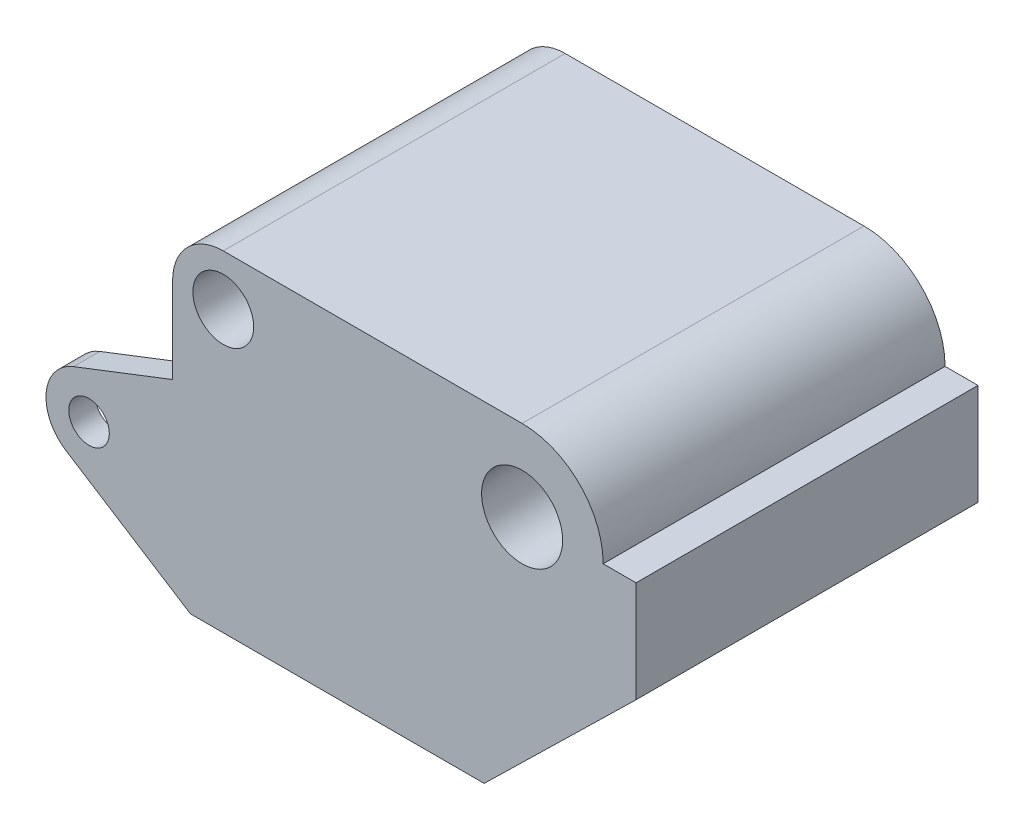
ISO-10303-21;
HEADER;
FILE_DESCRIPTION(('STEP AP214'),'2;1');
FILE_NAME('part.step','',(''),(''),'','','');
FILE_SCHEMA(('AUTOMOTIVE_DESIGN { 1 0 10303 214 1 1 1 1 }'));
ENDSEC;
DATA;
#1=APPLICATION_CONTEXT('core data for automotive mechanical design processes');
#2=APPLICATION_PROTOCOL_DEFINITION('international standard','automotive_design',2000,#1);
#3=PRODUCT_CONTEXT('',#1,'mechanical');
#4=PRODUCT('Part','Part','',(#3));
#5=PRODUCT_RELATED_PRODUCT_CATEGORY('part','',(#4));
#6=PRODUCT_DEFINITION_FORMATION('','',#4);
#7=PRODUCT_DEFINITION_CONTEXT('part definition',#1,'design');
#8=PRODUCT_DEFINITION('design','',#6,#7);
#9=PRODUCT_DEFINITION_SHAPE('','',#8);
#10=(LENGTH_UNIT() NAMED_UNIT(*) SI_UNIT(.MILLI.,.METRE.));
#11=(NAMED_UNIT(*) PLANE_ANGLE_UNIT() SI_UNIT($,.RADIAN.));
#12=(NAMED_UNIT(*) SI_UNIT($,.STERADIAN.) SOLID_ANGLE_UNIT());
#13=UNCERTAINTY_MEASURE_WITH_UNIT(LENGTH_MEASURE(1.E-05),#10,'distance_accuracy_value','');
#14=(GEOMETRIC_REPRESENTATION_CONTEXT(3) GLOBAL_UNCERTAINTY_ASSIGNED_CONTEXT((#13)) GLOBAL_UNIT_ASSIGNED_CONTEXT((#10,
#11,#12)) REPRESENTATION_CONTEXT('',''));
#15=CARTESIAN_POINT('',(0.,0.,0.));
#16=DIRECTION('',(0.,0.,1.));
#17=DIRECTION('',(1.,0.,0.));
#18=AXIS2_PLACEMENT_3D('',#15,#16,#17);
#19=CARTESIAN_POINT('',(34.9717534777319,-90.3641278351745,-8.75));
#20=DIRECTION('',(-0.360923115130806,0.932595574171503,0.));
#21=DIRECTION('',(-0.932595574171503,-0.360923115130806,0.));
#22=AXIS2_PLACEMENT_3D('',#19,#20,#21);
#23=PLANE('',#22);
#24=DIRECTION('',(0.,0.,1.));
#25=VECTOR('',#24,1.);
#26=CARTESIAN_POINT('',(-38.375,-118.75,-8.75));
#27=LINE('',#26,#25);
#28=CARTESIAN_POINT('',(-38.375,-118.75,-8.625));
#29=VERTEX_POINT('',#28);
#30=CARTESIAN_POINT('',(-38.375,-118.75,8.25));
#31=VERTEX_POINT('',#30);
#32=EDGE_CURVE('E101',#29,#31,#27,.T.);
#33=ORIENTED_EDGE('',*,*,#32,.F.);
#34=DIRECTION('',(-0.932595574171503,-0.360923115130806,0.));
#35=VECTOR('',#34,1.);
#36=CARTESIAN_POINT('',(34.9717534777319,-90.3641278351745,-8.62500000000001));
#37=LINE('',#36,#35);
#38=CARTESIAN_POINT('',(-43.266961619653,-120.643234404886,-8.625));
#39=VERTEX_POINT('',#38);
#40=EDGE_CURVE('E303',#29,#39,#37,.T.);
#41=ORIENTED_EDGE('',*,*,#40,.T.);
#42=DIRECTION('',(0.,0.,1.));
#43=VECTOR('',#42,1.);
#44=CARTESIAN_POINT('',(-43.266961619653,-120.643234404886,-8.75));
#45=LINE('',#44,#43);
#46=CARTESIAN_POINT('',(-43.266961619653,-120.643234404886,-7.325));
#47=VERTEX_POINT('',#46);
#48=EDGE_CURVE('E231',#39,#47,#45,.T.);
#49=ORIENTED_EDGE('',*,*,#48,.T.);
#50=DIRECTION('',(0.932595574171503,0.360923115130806,0.));
#51=VECTOR('',#50,1.);
#52=CARTESIAN_POINT('',(34.9717534777319,-90.3641278351745,-7.325));
#53=LINE('',#52,#51);
#54=CARTESIAN_POINT('',(-39.45,-119.166034945384,-7.325));
#55=VERTEX_POINT('',#54);
#56=EDGE_CURVE('E323',#47,#55,#53,.T.);
#57=ORIENTED_EDGE('',*,*,#56,.T.);
#58=DIRECTION('',(0.,0.,1.));
#59=VECTOR('',#58,1.);
#60=CARTESIAN_POINT('',(-39.45,-119.166034945384,-8.75));
#61=LINE('',#60,#59);
#62=CARTESIAN_POINT('',(-39.45,-119.166034945384,6.95));
#63=VERTEX_POINT('',#62);
#64=EDGE_CURVE('E326',#55,#63,#61,.T.);
#65=ORIENTED_EDGE('',*,*,#64,.T.);
#66=DIRECTION('',(0.932595574171503,0.360923115130806,0.));
#67=VECTOR('',#66,1.);
#68=CARTESIAN_POINT('',(34.9717534777319,-90.3641278351745,6.95));
#69=LINE('',#68,#67);
#70=CARTESIAN_POINT('',(-43.266961619653,-120.643234404886,6.95));
#71=VERTEX_POINT('',#70);
#72=EDGE_CURVE('E242',#71,#63,#69,.T.);
#73=ORIENTED_EDGE('',*,*,#72,.F.);
#74=CARTESIAN_POINT('',(-43.266961619653,-120.643234404886,8.25));
#75=VERTEX_POINT('',#74);
#76=EDGE_CURVE('E233',#71,#75,#45,.T.);
#77=ORIENTED_EDGE('',*,*,#76,.T.);
#78=DIRECTION('',(0.932595574171503,0.360923115130806,0.));
#79=VECTOR('',#78,1.);
#80=CARTESIAN_POINT('',(34.9717534777319,-90.3641278351745,8.24999999999999));
#81=LINE('',#80,#79);
#82=EDGE_CURVE('E117',#75,#31,#81,.T.);
#83=ORIENTED_EDGE('',*,*,#82,.T.);
#84=EDGE_LOOP('',(#33,#41,#49,#57,#65,#73,#77,#83));
#85=FACE_BOUND('',#84,.T.);
#86=ADVANCED_FACE('F93',(#85),#23,.T.);
#87=CARTESIAN_POINT('',(-68.9263475557154,-108.329490527067,-8.75));
#88=DIRECTION('',(0.536816725384805,0.84369888191649,0.));
#89=DIRECTION('',(-0.84369888191649,0.536816725384805,0.));
#90=AXIS2_PLACEMENT_3D('',#87,#88,#89);
#91=PLANE('',#90);
#92=DIRECTION('',(-0.84369888191649,0.536816725384805,0.));
#93=VECTOR('',#92,1.);
#94=CARTESIAN_POINT('',(-68.9263475557154,-108.329490527067,-8.62499999999999));
#95=LINE('',#94,#93);
#96=CARTESIAN_POINT('',(-37.5,-128.325,-8.625));
#97=VERTEX_POINT('',#96);
#98=CARTESIAN_POINT('',(-43.6407355414427,-124.417860124073,-8.625));
#99=VERTEX_POINT('',#98);
#100=EDGE_CURVE('E201',#97,#99,#95,.T.);
#101=ORIENTED_EDGE('',*,*,#100,.F.);
#102=DIRECTION('',(0.,0.,1.));
#103=VECTOR('',#102,1.);
#104=CARTESIAN_POINT('',(-37.5,-128.325,-8.75));
#105=LINE('',#104,#103);
#106=CARTESIAN_POINT('',(-37.5,-128.325,8.25));
#107=VERTEX_POINT('',#106);
#108=EDGE_CURVE('E215',#97,#107,#105,.T.);
#109=ORIENTED_EDGE('',*,*,#108,.T.);
#110=DIRECTION('',(0.84369888191649,-0.536816725384805,0.));
#111=VECTOR('',#110,1.);
#112=CARTESIAN_POINT('',(-68.9263475557154,-108.329490527067,8.25));
#113=LINE('',#112,#111);
#114=CARTESIAN_POINT('',(-43.6407355414427,-124.417860124073,8.25));
#115=VERTEX_POINT('',#114);
#116=EDGE_CURVE('E247',#115,#107,#113,.T.);
#117=ORIENTED_EDGE('',*,*,#116,.F.);
#118=DIRECTION('',(0.,0.,1.));
#119=VECTOR('',#118,1.);
#120=CARTESIAN_POINT('',(-43.6407355414427,-124.417860124073,-8.75));
#121=LINE('',#120,#119);
#122=CARTESIAN_POINT('',(-43.6407355414427,-124.417860124073,6.95));
#123=VERTEX_POINT('',#122);
#124=EDGE_CURVE('E227',#123,#115,#121,.T.);
#125=ORIENTED_EDGE('',*,*,#124,.F.);
#126=DIRECTION('',(0.84369888191649,-0.536816725384805,0.));
#127=VECTOR('',#126,1.);
#128=CARTESIAN_POINT('',(-68.9263475557154,-108.329490527067,6.95));
#129=LINE('',#128,#127);
#130=CARTESIAN_POINT('',(-39.45,-127.084281733167,6.95));
#131=VERTEX_POINT('',#130);
#132=EDGE_CURVE('E315',#123,#131,#129,.T.);
#133=ORIENTED_EDGE('',*,*,#132,.T.);
#134=DIRECTION('',(0.,0.,1.));
#135=VECTOR('',#134,1.);
#136=CARTESIAN_POINT('',(-39.45,-127.084281733167,-8.75));
#137=LINE('',#136,#135);
#138=CARTESIAN_POINT('',(-39.45,-127.084281733167,-7.325));
#139=VERTEX_POINT('',#138);
#140=EDGE_CURVE('E13',#139,#131,#137,.T.);
#141=ORIENTED_EDGE('',*,*,#140,.F.);
#142=DIRECTION('',(0.84369888191649,-0.536816725384805,0.));
#143=VECTOR('',#142,1.);
#144=CARTESIAN_POINT('',(-68.9263475557154,-108.329490527067,-7.325));
#145=LINE('',#144,#143);
#146=CARTESIAN_POINT('',(-43.6407355414427,-124.417860124073,-7.325));
#147=VERTEX_POINT('',#146);
#148=EDGE_CURVE('E321',#147,#139,#145,.T.);
#149=ORIENTED_EDGE('',*,*,#148,.F.);
#150=EDGE_CURVE('E217',#99,#147,#121,.T.);
#151=ORIENTED_EDGE('',*,*,#150,.F.);
#152=EDGE_LOOP('',(#101,#109,#117,#125,#133,#141,#149,#151));
#153=FACE_BOUND('',#152,.T.);
#154=ADVANCED_FACE('F213',(#153),#91,.F.);
#155=CARTESIAN_POINT('',(-42.5,-122.625,-8.75));
#156=DIRECTION('',(0.,0.,1.));
#157=DIRECTION('',(1.,0.,0.));
#158=AXIS2_PLACEMENT_3D('',#155,#156,#157);
#159=CYLINDRICAL_SURFACE('',#158,2.125);
#160=ORIENTED_EDGE('',*,*,#48,.F.);
#161=CARTESIAN_POINT('',(-42.5,-122.625,-8.625));
#162=DIRECTION('',(0.,0.,-1.));
#163=DIRECTION('',(-1.,0.,0.));
#164=AXIS2_PLACEMENT_3D('',#161,#162,#163);
#165=CIRCLE('',#164,2.125);
#166=EDGE_CURVE('E219',#39,#99,#165,.F.);
#167=ORIENTED_EDGE('',*,*,#166,.T.);
#168=ORIENTED_EDGE('',*,*,#150,.T.);
#169=CARTESIAN_POINT('',(-42.5,-122.625,-7.325));
#170=DIRECTION('',(0.,0.,1.));
#171=DIRECTION('',(1.,0.,0.));
#172=AXIS2_PLACEMENT_3D('',#169,#170,#171);
#173=CIRCLE('',#172,2.125);
#174=EDGE_CURVE('E241',#147,#47,#173,.F.);
#175=ORIENTED_EDGE('',*,*,#174,.T.);
#176=EDGE_LOOP('',(#160,#167,#168,#175));
#177=FACE_BOUND('',#176,.T.);
#178=ADVANCED_FACE('F392',(#177),#159,.T.);
#179=CARTESIAN_POINT('',(-42.5,-122.625,-8.75));
#180=DIRECTION('',(0.,0.,1.));
#181=DIRECTION('',(1.,0.,0.));
#182=AXIS2_PLACEMENT_3D('',#179,#180,#181);
#183=CYLINDRICAL_SURFACE('',#182,0.999999999999998);
#184=CARTESIAN_POINT('',(-42.5,-122.625,-7.325));
#185=DIRECTION('',(0.,0.,1.));
#186=DIRECTION('',(1.,0.,0.));
#187=AXIS2_PLACEMENT_3D('',#184,#185,#186);
#188=CIRCLE('',#187,0.999999999999998);
#189=CARTESIAN_POINT('',(-41.5,-122.625,-7.325));
#190=VERTEX_POINT('',#189);
#191=EDGE_CURVE('E239',#190,#190,#188,.F.);
#192=CARTESIAN_POINT('',(-42.5,-122.625,-8.625));
#193=DIRECTION('',(0.,0.,-1.));
#194=DIRECTION('',(-1.,0.,0.));
#195=AXIS2_PLACEMENT_3D('',#192,#193,#194);
#196=CIRCLE('',#195,0.999999999999998);
#197=CARTESIAN_POINT('',(-41.5,-122.625,-8.625));
#198=VERTEX_POINT('',#197);
#199=EDGE_CURVE('E218',#198,#198,#196,.F.);
#200=CARTESIAN_POINT('',(-41.5,-122.625,-7.325));
#201=CARTESIAN_POINT('',(-41.5,-122.625,-7.33854166666667));
#202=CARTESIAN_POINT('',(-41.5,-122.625,-7.35208333333333));
#203=CARTESIAN_POINT('',(-41.5,-122.625,-7.37916666666667));
#204=CARTESIAN_POINT('',(-41.5,-122.625,-7.39270833333333));
#205=CARTESIAN_POINT('',(-41.5,-122.625,-7.41979166666667));
#206=CARTESIAN_POINT('',(-41.5,-122.625,-7.43333333333333));
#207=CARTESIAN_POINT('',(-41.5,-122.625,-7.46041666666667));
#208=CARTESIAN_POINT('',(-41.5,-122.625,-7.47395833333333));
#209=CARTESIAN_POINT('',(-41.5,-122.625,-7.50104166666667));
#210=CARTESIAN_POINT('',(-41.5,-122.625,-7.51458333333333));
#211=CARTESIAN_POINT('',(-41.5,-122.625,-7.54166666666667));
#212=CARTESIAN_POINT('',(-41.5,-122.625,-7.55520833333333));
#213=CARTESIAN_POINT('',(-41.5,-122.625,-7.58229166666667));
#214=CARTESIAN_POINT('',(-41.5,-122.625,-7.59583333333333));
#215=CARTESIAN_POINT('',(-41.5,-122.625,-7.62291666666667));
#216=CARTESIAN_POINT('',(-41.5,-122.625,-7.63645833333333));
#217=CARTESIAN_POINT('',(-41.5,-122.625,-7.66354166666667));
#218=CARTESIAN_POINT('',(-41.5,-122.625,-7.67708333333333));
#219=CARTESIAN_POINT('',(-41.5,-122.625,-7.70416666666667));
#220=CARTESIAN_POINT('',(-41.5,-122.625,-7.71770833333333));
#221=CARTESIAN_POINT('',(-41.5,-122.625,-7.74479166666667));
#222=CARTESIAN_POINT('',(-41.5,-122.625,-7.75833333333333));
#223=CARTESIAN_POINT('',(-41.5,-122.625,-7.78541666666667));
#224=CARTESIAN_POINT('',(-41.5,-122.625,-7.79895833333333));
#225=CARTESIAN_POINT('',(-41.5,-122.625,-7.82604166666667));
#226=CARTESIAN_POINT('',(-41.5,-122.625,-7.83958333333333));
#227=CARTESIAN_POINT('',(-41.5,-122.625,-7.86666666666667));
#228=CARTESIAN_POINT('',(-41.5,-122.625,-7.88020833333333));
#229=CARTESIAN_POINT('',(-41.5,-122.625,-7.90729166666667));
#230=CARTESIAN_POINT('',(-41.5,-122.625,-7.92083333333333));
#231=CARTESIAN_POINT('',(-41.5,-122.625,-7.94791666666667));
#232=CARTESIAN_POINT('',(-41.5,-122.625,-7.96145833333333));
#233=CARTESIAN_POINT('',(-41.5,-122.625,-7.98854166666667));
#234=CARTESIAN_POINT('',(-41.5,-122.625,-8.00208333333333));
#235=CARTESIAN_POINT('',(-41.5,-122.625,-8.02916666666667));
#236=CARTESIAN_POINT('',(-41.5,-122.625,-8.04270833333333));
#237=CARTESIAN_POINT('',(-41.5,-122.625,-8.06979166666667));
#238=CARTESIAN_POINT('',(-41.5,-122.625,-8.08333333333333));
#239=CARTESIAN_POINT('',(-41.5,-122.625,-8.11041666666667));
#240=CARTESIAN_POINT('',(-41.5,-122.625,-8.12395833333333));
#241=CARTESIAN_POINT('',(-41.5,-122.625,-8.15104166666667));
#242=CARTESIAN_POINT('',(-41.5,-122.625,-8.16458333333333));
#243=CARTESIAN_POINT('',(-41.5,-122.625,-8.19166666666667));
#244=CARTESIAN_POINT('',(-41.5,-122.625,-8.20520833333333));
#245=CARTESIAN_POINT('',(-41.5,-122.625,-8.23229166666667));
#246=CARTESIAN_POINT('',(-41.5,-122.625,-8.24583333333333));
#247=CARTESIAN_POINT('',(-41.5,-122.625,-8.27291666666667));
#248=CARTESIAN_POINT('',(-41.5,-122.625,-8.28645833333333));
#249=CARTESIAN_POINT('',(-41.5,-122.625,-8.31354166666667));
#250=CARTESIAN_POINT('',(-41.5,-122.625,-8.32708333333333));
#251=CARTESIAN_POINT('',(-41.5,-122.625,-8.35416666666667));
#252=CARTESIAN_POINT('',(-41.5,-122.625,-8.36770833333333));
#253=CARTESIAN_POINT('',(-41.5,-122.625,-8.39479166666667));
#254=CARTESIAN_POINT('',(-41.5,-122.625,-8.40833333333333));
#255=CARTESIAN_POINT('',(-41.5,-122.625,-8.43541666666667));
#256=CARTESIAN_POINT('',(-41.5,-122.625,-8.44895833333333));
#257=CARTESIAN_POINT('',(-41.5,-122.625,-8.47604166666667));
#258=CARTESIAN_POINT('',(-41.5,-122.625,-8.48958333333333));
#259=CARTESIAN_POINT('',(-41.5,-122.625,-8.51666666666667));
#260=CARTESIAN_POINT('',(-41.5,-122.625,-8.53020833333333));
#261=CARTESIAN_POINT('',(-41.5,-122.625,-8.55729166666667));
#262=CARTESIAN_POINT('',(-41.5,-122.625,-8.57083333333333));
#263=CARTESIAN_POINT('',(-41.5,-122.625,-8.59791666666667));
#264=CARTESIAN_POINT('',(-41.5,-122.625,-8.61145833333333));
#265=CARTESIAN_POINT('',(-41.5,-122.625,-8.625));
#266=B_SPLINE_CURVE_WITH_KNOTS('',3,(#200,#201,#202,#203,#204,#205,#206,#207,#208,#209,#210,
#211,#212,#213,#214,#215,#216,#217,#218,#219,#220,#221,#222,#223,#224,#225,#226,#227,#228,#229,
#230,#231,#232,#233,#234,#235,#236,#237,#238,#239,#240,#241,#242,#243,#244,#245,#246,#247,#248,
#249,#250,#251,#252,#253,#254,#255,#256,#257,#258,#259,#260,#261,#262,#263,#264,#265),
.UNSPECIFIED.,.F.,.F.,(4,2,2,2,2,2,2,2,2,2,2,2,2,2,2,2,2,2,2,2,2,2,2,2,2,2,2,2,2,2,2,2,4),(0.,
0.0406250000000007,0.0812500000000006,0.121875,0.1625,0.203125,0.24375,0.284375,
0.325000000000001,0.365625,0.40625,0.446875,0.4875,0.528125000000001,0.56875,0.609375000000001,
0.65,0.690625,0.731250000000001,0.771875,0.812500000000001,0.853125,0.89375,0.934374999999999,
0.975,1.015625,1.05625,1.096875,1.1375,1.178125,1.21875,1.259375,1.3),.UNSPECIFIED.);
#267=EDGE_CURVE('BSEAM394',#190,#198,#266,.T.);
#268=ORIENTED_EDGE('',*,*,#191,.F.);
#269=ORIENTED_EDGE('',*,*,#199,.F.);
#270=ORIENTED_EDGE('',*,*,#267,.T.);
#271=ORIENTED_EDGE('',*,*,#267,.F.);
#272=EDGE_LOOP('',(#268,#270,#269,#271));
#273=FACE_BOUND('',#272,.T.);
#274=ADVANCED_FACE('F394',(#273),#183,.F.);
#275=CARTESIAN_POINT('',(-38.375,0.,-8.75));
#276=DIRECTION('',(-1.,0.,0.));
#277=DIRECTION('',(0.,0.,1.));
#278=AXIS2_PLACEMENT_3D('',#275,#276,#277);
#279=PLANE('',#278);
#280=DIRECTION('',(0.,0.,1.));
#281=VECTOR('',#280,1.);
#282=CARTESIAN_POINT('',(-38.375,-114.5,-8.75));
#283=LINE('',#282,#281);
#284=CARTESIAN_POINT('',(-38.375,-114.5,-8.625));
#285=VERTEX_POINT('',#284);
#286=CARTESIAN_POINT('',(-38.375,-114.5,8.25));
#287=VERTEX_POINT('',#286);
#288=EDGE_CURVE('E331',#285,#287,#283,.T.);
#289=ORIENTED_EDGE('',*,*,#288,.F.);
#290=DIRECTION('',(0.,-1.,0.));
#291=VECTOR('',#290,1.);
#292=CARTESIAN_POINT('',(-38.375,0.,-8.625));
#293=LINE('',#292,#291);
#294=EDGE_CURVE('E300',#285,#29,#293,.T.);
#295=ORIENTED_EDGE('',*,*,#294,.T.);
#296=ORIENTED_EDGE('',*,*,#32,.T.);
#297=DIRECTION('',(0.,1.,0.));
#298=VECTOR('',#297,1.);
#299=CARTESIAN_POINT('',(-38.375,0.,8.25));
#300=LINE('',#299,#298);
#301=EDGE_CURVE('E257',#31,#287,#300,.T.);
#302=ORIENTED_EDGE('',*,*,#301,.T.);
#303=EDGE_LOOP('',(#289,#295,#296,#302));
#304=FACE_BOUND('',#303,.T.);
#305=ADVANCED_FACE('F370',(#304),#279,.T.);
#306=CARTESIAN_POINT('',(-35.875,-114.5,-8.75));
#307=DIRECTION('',(0.,0.,1.));
#308=DIRECTION('',(1.,0.,0.));
#309=AXIS2_PLACEMENT_3D('',#306,#307,#308);
#310=CYLINDRICAL_SURFACE('',#309,2.5);
#311=DIRECTION('',(0.,0.,1.));
#312=VECTOR('',#311,1.);
#313=CARTESIAN_POINT('',(-35.875,-112.,-8.75));
#314=LINE('',#313,#312);
#315=CARTESIAN_POINT('',(-35.875,-112.,-8.625));
#316=VERTEX_POINT('',#315);
#317=CARTESIAN_POINT('',(-35.875,-112.,8.25));
#318=VERTEX_POINT('',#317);
#319=EDGE_CURVE('E334',#316,#318,#314,.T.);
#320=ORIENTED_EDGE('',*,*,#319,.F.);
#321=CARTESIAN_POINT('',(-35.875,-114.5,-8.625));
#322=DIRECTION('',(0.,0.,-1.));
#323=DIRECTION('',(-1.,0.,0.));
#324=AXIS2_PLACEMENT_3D('',#321,#322,#323);
#325=CIRCLE('',#324,2.5);
#326=EDGE_CURVE('E297',#316,#285,#325,.F.);
#327=ORIENTED_EDGE('',*,*,#326,.T.);
#328=ORIENTED_EDGE('',*,*,#288,.T.);
#329=CARTESIAN_POINT('',(-35.875,-114.5,8.25));
#330=DIRECTION('',(0.,0.,1.));
#331=DIRECTION('',(1.,0.,0.));
#332=AXIS2_PLACEMENT_3D('',#329,#330,#331);
#333=CIRCLE('',#332,2.5);
#334=EDGE_CURVE('E260',#287,#318,#333,.F.);
#335=ORIENTED_EDGE('',*,*,#334,.T.);
#336=EDGE_LOOP('',(#320,#327,#328,#335));
#337=FACE_BOUND('',#336,.T.);
#338=ADVANCED_FACE('F367',(#337),#310,.T.);
#339=CARTESIAN_POINT('',(0.,-112.,-8.75));
#340=DIRECTION('',(0.,1.,0.));
#341=DIRECTION('',(0.,0.,1.));
#342=AXIS2_PLACEMENT_3D('',#339,#340,#341);
#343=PLANE('',#342);
#344=DIRECTION('',(0.,0.,1.));
#345=VECTOR('',#344,1.);
#346=CARTESIAN_POINT('',(-21.125,-112.,-8.75));
#347=LINE('',#346,#345);
#348=CARTESIAN_POINT('',(-21.125,-112.,-8.625));
#349=VERTEX_POINT('',#348);
#350=CARTESIAN_POINT('',(-21.125,-112.,8.25));
#351=VERTEX_POINT('',#350);
#352=EDGE_CURVE('E337',#349,#351,#347,.T.);
#353=ORIENTED_EDGE('',*,*,#352,.F.);
#354=DIRECTION('',(-1.,0.,0.));
#355=VECTOR('',#354,1.);
#356=CARTESIAN_POINT('',(0.,-112.,-8.625));
#357=LINE('',#356,#355);
#358=EDGE_CURVE('E294',#349,#316,#357,.T.);
#359=ORIENTED_EDGE('',*,*,#358,.T.);
#360=ORIENTED_EDGE('',*,*,#319,.T.);
#361=DIRECTION('',(1.,0.,0.));
#362=VECTOR('',#361,1.);
#363=CARTESIAN_POINT('',(0.,-112.,8.25));
#364=LINE('',#363,#362);
#365=EDGE_CURVE('E263',#318,#351,#364,.T.);
#366=ORIENTED_EDGE('',*,*,#365,.T.);
#367=EDGE_LOOP('',(#353,#359,#360,#366));
#368=FACE_BOUND('',#367,.T.);
#369=ADVANCED_FACE('F364',(#368),#343,.T.);
#370=CARTESIAN_POINT('',(-21.125,-116.,-8.75));
#371=DIRECTION('',(0.,0.,1.));
#372=DIRECTION('',(1.,0.,0.));
#373=AXIS2_PLACEMENT_3D('',#370,#371,#372);
#374=CYLINDRICAL_SURFACE('',#373,4.);
#375=DIRECTION('',(0.,0.,1.));
#376=VECTOR('',#375,1.);
#377=CARTESIAN_POINT('',(-17.125,-116.,-8.75));
#378=LINE('',#377,#376);
#379=CARTESIAN_POINT('',(-17.125,-116.,-8.625));
#380=VERTEX_POINT('',#379);
#381=CARTESIAN_POINT('',(-17.125,-116.,8.25));
#382=VERTEX_POINT('',#381);
#383=EDGE_CURVE('E340',#380,#382,#378,.T.);
#384=ORIENTED_EDGE('',*,*,#383,.F.);
#385=CARTESIAN_POINT('',(-21.125,-116.,-8.625));
#386=DIRECTION('',(0.,0.,-1.));
#387=DIRECTION('',(-1.,0.,0.));
#388=AXIS2_PLACEMENT_3D('',#385,#386,#387);
#389=CIRCLE('',#388,4.);
#390=EDGE_CURVE('E291',#380,#349,#389,.F.);
#391=ORIENTED_EDGE('',*,*,#390,.T.);
#392=ORIENTED_EDGE('',*,*,#352,.T.);
#393=CARTESIAN_POINT('',(-21.125,-116.,8.25));
#394=DIRECTION('',(0.,0.,1.));
#395=DIRECTION('',(1.,0.,0.));
#396=AXIS2_PLACEMENT_3D('',#393,#394,#395);
#397=CIRCLE('',#396,4.);
#398=EDGE_CURVE('E266',#351,#382,#397,.F.);
#399=ORIENTED_EDGE('',*,*,#398,.T.);
#400=EDGE_LOOP('',(#384,#391,#392,#399));
#401=FACE_BOUND('',#400,.T.);
#402=ADVANCED_FACE('F361',(#401),#374,.T.);
#403=CARTESIAN_POINT('',(0.,-116.,-8.75));
#404=DIRECTION('',(0.,1.,0.));
#405=DIRECTION('',(0.,0.,1.));
#406=AXIS2_PLACEMENT_3D('',#403,#404,#405);
#407=PLANE('',#406);
#408=DIRECTION('',(0.,0.,1.));
#409=VECTOR('',#408,1.);
#410=CARTESIAN_POINT('',(-15.5,-116.,-8.75));
#411=LINE('',#410,#409);
#412=CARTESIAN_POINT('',(-15.5,-116.,-8.625));
#413=VERTEX_POINT('',#412);
#414=CARTESIAN_POINT('',(-15.5,-116.,8.25));
#415=VERTEX_POINT('',#414);
#416=EDGE_CURVE('E343',#413,#415,#411,.T.);
#417=ORIENTED_EDGE('',*,*,#416,.F.);
#418=DIRECTION('',(-1.,0.,0.));
#419=VECTOR('',#418,1.);
#420=CARTESIAN_POINT('',(0.,-116.,-8.625));
#421=LINE('',#420,#419);
#422=EDGE_CURVE('E288',#413,#380,#421,.T.);
#423=ORIENTED_EDGE('',*,*,#422,.T.);
#424=ORIENTED_EDGE('',*,*,#383,.T.);
#425=DIRECTION('',(1.,0.,0.));
#426=VECTOR('',#425,1.);
#427=CARTESIAN_POINT('',(0.,-116.,8.25));
#428=LINE('',#427,#426);
#429=EDGE_CURVE('E269',#382,#415,#428,.T.);
#430=ORIENTED_EDGE('',*,*,#429,.T.);
#431=EDGE_LOOP('',(#417,#423,#424,#430));
#432=FACE_BOUND('',#431,.T.);
#433=ADVANCED_FACE('F358',(#432),#407,.T.);
#434=CARTESIAN_POINT('',(-15.5,0.,-8.75));
#435=DIRECTION('',(-1.,0.,0.));
#436=DIRECTION('',(0.,-1.,0.));
#437=AXIS2_PLACEMENT_3D('',#434,#435,#436);
#438=PLANE('',#437);
#439=DIRECTION('',(0.,-1.,0.));
#440=VECTOR('',#439,1.);
#441=CARTESIAN_POINT('',(-15.5,0.,-8.625));
#442=LINE('',#441,#440);
#443=CARTESIAN_POINT('',(-15.5,-121.,-8.625));
#444=VERTEX_POINT('',#443);
#445=EDGE_CURVE('E286',#413,#444,#442,.T.);
#446=ORIENTED_EDGE('',*,*,#445,.F.);
#447=ORIENTED_EDGE('',*,*,#416,.T.);
#448=DIRECTION('',(0.,1.,0.));
#449=VECTOR('',#448,1.);
#450=CARTESIAN_POINT('',(-15.5,0.,8.25));
#451=LINE('',#450,#449);
#452=CARTESIAN_POINT('',(-15.5,-121.,8.25));
#453=VERTEX_POINT('',#452);
#454=EDGE_CURVE('E272',#453,#415,#451,.T.);
#455=ORIENTED_EDGE('',*,*,#454,.F.);
#456=DIRECTION('',(0.,0.,1.));
#457=VECTOR('',#456,1.);
#458=CARTESIAN_POINT('',(-15.5,-121.,-8.75));
#459=LINE('',#458,#457);
#460=EDGE_CURVE('E225',#444,#453,#459,.T.);
#461=ORIENTED_EDGE('',*,*,#460,.F.);
#462=EDGE_LOOP('',(#446,#447,#455,#461));
#463=FACE_BOUND('',#462,.T.);
#464=ADVANCED_FACE('F353',(#463),#438,.F.);
#465=CARTESIAN_POINT('',(52.9160842541044,-54.180291045158,-8.75));
#466=DIRECTION('',(-0.698711142139106,0.715403899801131,0.));
#467=DIRECTION('',(-0.715403899801131,-0.698711142139106,0.));
#468=AXIS2_PLACEMENT_3D('',#465,#466,#467);
#469=PLANE('',#468);
#470=DIRECTION('',(-0.715403899801131,-0.698711142139106,0.));
#471=VECTOR('',#470,1.);
#472=CARTESIAN_POINT('',(52.9160842541044,-54.180291045158,-8.62500000000001));
#473=LINE('',#472,#471);
#474=CARTESIAN_POINT('',(-23.,-128.325,-8.625));
#475=VERTEX_POINT('',#474);
#476=EDGE_CURVE('E109',#444,#475,#473,.T.);
#477=ORIENTED_EDGE('',*,*,#476,.F.);
#478=ORIENTED_EDGE('',*,*,#460,.T.);
#479=DIRECTION('',(0.715403899801131,0.698711142139106,0.));
#480=VECTOR('',#479,1.);
#481=CARTESIAN_POINT('',(52.9160842541044,-54.180291045158,8.24999999999999));
#482=LINE('',#481,#480);
#483=CARTESIAN_POINT('',(-23.,-128.325,8.25));
#484=VERTEX_POINT('',#483);
#485=EDGE_CURVE('E274',#484,#453,#482,.T.);
#486=ORIENTED_EDGE('',*,*,#485,.F.);
#487=DIRECTION('',(0.,0.,1.));
#488=VECTOR('',#487,1.);
#489=CARTESIAN_POINT('',(-23.,-128.325,-8.75));
#490=LINE('',#489,#488);
#491=EDGE_CURVE('E223',#475,#484,#490,.T.);
#492=ORIENTED_EDGE('',*,*,#491,.F.);
#493=EDGE_LOOP('',(#477,#478,#486,#492));
#494=FACE_BOUND('',#493,.T.);
#495=ADVANCED_FACE('F349',(#494),#469,.F.);
#496=CARTESIAN_POINT('',(0.,-128.325,-8.75));
#497=DIRECTION('',(0.,1.,0.));
#498=DIRECTION('',(0.,0.,1.));
#499=AXIS2_PLACEMENT_3D('',#496,#497,#498);
#500=PLANE('',#499);
#501=DIRECTION('',(-1.,0.,0.));
#502=VECTOR('',#501,1.);
#503=CARTESIAN_POINT('',(2.71918770134078,-128.325,-8.625));
#504=LINE('',#503,#502);
#505=EDGE_CURVE('E197',#475,#97,#504,.T.);
#506=ORIENTED_EDGE('',*,*,#505,.F.);
#507=ORIENTED_EDGE('',*,*,#491,.T.);
#508=DIRECTION('',(1.,0.,0.));
#509=VECTOR('',#508,1.);
#510=CARTESIAN_POINT('',(2.71918770134078,-128.325,8.25));
#511=LINE('',#510,#509);
#512=EDGE_CURVE('E208',#107,#484,#511,.T.);
#513=ORIENTED_EDGE('',*,*,#512,.F.);
#514=ORIENTED_EDGE('',*,*,#108,.F.);
#515=EDGE_LOOP('',(#506,#507,#513,#514));
#516=FACE_BOUND('',#515,.T.);
#517=ADVANCED_FACE('F222',(#516),#500,.F.);
#518=ORIENTED_EDGE('',*,*,#124,.T.);
#519=CARTESIAN_POINT('',(-42.5,-122.625,8.25));
#520=DIRECTION('',(0.,0.,1.));
#521=DIRECTION('',(1.,0.,0.));
#522=AXIS2_PLACEMENT_3D('',#519,#520,#521);
#523=CIRCLE('',#522,2.125);
#524=EDGE_CURVE('E244',#115,#75,#523,.F.);
#525=ORIENTED_EDGE('',*,*,#524,.T.);
#526=ORIENTED_EDGE('',*,*,#76,.F.);
#527=CARTESIAN_POINT('',(-42.5,-122.625,6.95));
#528=DIRECTION('',(0.,0.,1.));
#529=DIRECTION('',(1.,0.,0.));
#530=AXIS2_PLACEMENT_3D('',#527,#528,#529);
#531=CIRCLE('',#530,2.125);
#532=EDGE_CURVE('E237',#123,#71,#531,.F.);
#533=ORIENTED_EDGE('',*,*,#532,.F.);
#534=EDGE_LOOP('',(#518,#525,#526,#533));
#535=FACE_BOUND('',#534,.T.);
#536=ADVANCED_FACE('F376',(#535),#159,.T.);
#537=CARTESIAN_POINT('',(-42.5,-122.625,6.95));
#538=DIRECTION('',(0.,0.,1.));
#539=DIRECTION('',(1.,0.,0.));
#540=AXIS2_PLACEMENT_3D('',#537,#538,#539);
#541=CIRCLE('',#540,0.999999999999998);
#542=CARTESIAN_POINT('',(-41.5,-122.625,6.95));
#543=VERTEX_POINT('',#542);
#544=EDGE_CURVE('E234',#543,#543,#541,.F.);
#545=CARTESIAN_POINT('',(-42.5,-122.625,8.25));
#546=DIRECTION('',(0.,0.,1.));
#547=DIRECTION('',(1.,0.,0.));
#548=AXIS2_PLACEMENT_3D('',#545,#546,#547);
#549=CIRCLE('',#548,0.999999999999998);
#550=CARTESIAN_POINT('',(-41.5,-122.625,8.25));
#551=VERTEX_POINT('',#550);
#552=EDGE_CURVE('E207',#551,#551,#549,.F.);
#553=CARTESIAN_POINT('',(-41.5,-122.625,6.95));
#554=CARTESIAN_POINT('',(-41.5,-122.625,6.96354166666666));
#555=CARTESIAN_POINT('',(-41.5,-122.625,6.97708333333333));
#556=CARTESIAN_POINT('',(-41.5,-122.625,7.00416666666666));
#557=CARTESIAN_POINT('',(-41.5,-122.625,7.01770833333333));
#558=CARTESIAN_POINT('',(-41.5,-122.625,7.04479166666667));
#559=CARTESIAN_POINT('',(-41.5,-122.625,7.05833333333333));
#560=CARTESIAN_POINT('',(-41.5,-122.625,7.08541666666666));
#561=CARTESIAN_POINT('',(-41.5,-122.625,7.09895833333333));
#562=CARTESIAN_POINT('',(-41.5,-122.625,7.12604166666666));
#563=CARTESIAN_POINT('',(-41.5,-122.625,7.13958333333333));
#564=CARTESIAN_POINT('',(-41.5,-122.625,7.16666666666667));
#565=CARTESIAN_POINT('',(-41.5,-122.625,7.18020833333333));
#566=CARTESIAN_POINT('',(-41.5,-122.625,7.20729166666666));
#567=CARTESIAN_POINT('',(-41.5,-122.625,7.22083333333333));
#568=CARTESIAN_POINT('',(-41.5,-122.625,7.24791666666666));
#569=CARTESIAN_POINT('',(-41.5,-122.625,7.26145833333333));
#570=CARTESIAN_POINT('',(-41.5,-122.625,7.28854166666666));
#571=CARTESIAN_POINT('',(-41.5,-122.625,7.30208333333333));
#572=CARTESIAN_POINT('',(-41.5,-122.625,7.32916666666666));
#573=CARTESIAN_POINT('',(-41.5,-122.625,7.34270833333333));
#574=CARTESIAN_POINT('',(-41.5,-122.625,7.36979166666666));
#575=CARTESIAN_POINT('',(-41.5,-122.625,7.38333333333333));
#576=CARTESIAN_POINT('',(-41.5,-122.625,7.41041666666666));
#577=CARTESIAN_POINT('',(-41.5,-122.625,7.42395833333333));
#578=CARTESIAN_POINT('',(-41.5,-122.625,7.45104166666667));
#579=CARTESIAN_POINT('',(-41.5,-122.625,7.46458333333333));
#580=CARTESIAN_POINT('',(-41.5,-122.625,7.49166666666666));
#581=CARTESIAN_POINT('',(-41.5,-122.625,7.50520833333333));
#582=CARTESIAN_POINT('',(-41.5,-122.625,7.53229166666667));
#583=CARTESIAN_POINT('',(-41.5,-122.625,7.54583333333333));
#584=CARTESIAN_POINT('',(-41.5,-122.625,7.57291666666667));
#585=CARTESIAN_POINT('',(-41.5,-122.625,7.58645833333333));
#586=CARTESIAN_POINT('',(-41.5,-122.625,7.61354166666667));
#587=CARTESIAN_POINT('',(-41.5,-122.625,7.62708333333333));
#588=CARTESIAN_POINT('',(-41.5,-122.625,7.65416666666667));
#589=CARTESIAN_POINT('',(-41.5,-122.625,7.66770833333333));
#590=CARTESIAN_POINT('',(-41.5,-122.625,7.69479166666667));
#591=CARTESIAN_POINT('',(-41.5,-122.625,7.70833333333333));
#592=CARTESIAN_POINT('',(-41.5,-122.625,7.73541666666667));
#593=CARTESIAN_POINT('',(-41.5,-122.625,7.74895833333333));
#594=CARTESIAN_POINT('',(-41.5,-122.625,7.77604166666667));
#595=CARTESIAN_POINT('',(-41.5,-122.625,7.78958333333333));
#596=CARTESIAN_POINT('',(-41.5,-122.625,7.81666666666667));
#597=CARTESIAN_POINT('',(-41.5,-122.625,7.83020833333333));
#598=CARTESIAN_POINT('',(-41.5,-122.625,7.85729166666667));
#599=CARTESIAN_POINT('',(-41.5,-122.625,7.87083333333333));
#600=CARTESIAN_POINT('',(-41.5,-122.625,7.89791666666667));
#601=CARTESIAN_POINT('',(-41.5,-122.625,7.91145833333333));
#602=CARTESIAN_POINT('',(-41.5,-122.625,7.93854166666667));
#603=CARTESIAN_POINT('',(-41.5,-122.625,7.95208333333333));
#604=CARTESIAN_POINT('',(-41.5,-122.625,7.97916666666667));
#605=CARTESIAN_POINT('',(-41.5,-122.625,7.99270833333333));
#606=CARTESIAN_POINT('',(-41.5,-122.625,8.01979166666667));
#607=CARTESIAN_POINT('',(-41.5,-122.625,8.03333333333333));
#608=CARTESIAN_POINT('',(-41.5,-122.625,8.06041666666667));
#609=CARTESIAN_POINT('',(-41.5,-122.625,8.07395833333333));
#610=CARTESIAN_POINT('',(-41.5,-122.625,8.10104166666667));
#611=CARTESIAN_POINT('',(-41.5,-122.625,8.11458333333333));
#612=CARTESIAN_POINT('',(-41.5,-122.625,8.14166666666667));
#613=CARTESIAN_POINT('',(-41.5,-122.625,8.15520833333333));
#614=CARTESIAN_POINT('',(-41.5,-122.625,8.18229166666667));
#615=CARTESIAN_POINT('',(-41.5,-122.625,8.19583333333333));
#616=CARTESIAN_POINT('',(-41.5,-122.625,8.22291666666667));
#617=CARTESIAN_POINT('',(-41.5,-122.625,8.23645833333333));
#618=CARTESIAN_POINT('',(-41.5,-122.625,8.25));
#619=B_SPLINE_CURVE_WITH_KNOTS('',3,(#553,#554,#555,#556,#557,#558,#559,#560,#561,#562,#563,
#564,#565,#566,#567,#568,#569,#570,#571,#572,#573,#574,#575,#576,#577,#578,#579,#580,#581,#582,
#583,#584,#585,#586,#587,#588,#589,#590,#591,#592,#593,#594,#595,#596,#597,#598,#599,#600,#601,
#602,#603,#604,#605,#606,#607,#608,#609,#610,#611,#612,#613,#614,#615,#616,#617,#618),
.UNSPECIFIED.,.F.,.F.,(4,2,2,2,2,2,2,2,2,2,2,2,2,2,2,2,2,2,2,2,2,2,2,2,2,2,2,2,2,2,2,2,4),(0.,
0.040624999999999,0.0812500000000015,0.121875,0.162499999999999,0.203125000000002,
0.243750000000001,0.284375,0.324999999999999,0.365625000000001,0.40625,0.446874999999999,
0.487500000000002,0.528125000000001,0.56875,0.609375000000002,0.650000000000001,0.690625,
0.731250000000003,0.771875000000002,0.812500000000001,0.853125000000003,0.893750000000002,
0.934375000000001,0.975000000000004,1.015625,1.05625,1.096875,1.1375,1.178125,1.21875,1.259375,
1.3),.UNSPECIFIED.);
#620=EDGE_CURVE('BSEAM401',#543,#551,#619,.T.);
#621=ORIENTED_EDGE('',*,*,#544,.T.);
#622=ORIENTED_EDGE('',*,*,#552,.F.);
#623=ORIENTED_EDGE('',*,*,#620,.T.);
#624=ORIENTED_EDGE('',*,*,#620,.F.);
#625=EDGE_LOOP('',(#621,#623,#622,#624));
#626=FACE_BOUND('',#625,.T.);
#627=ADVANCED_FACE('F401',(#626),#183,.F.);
#628=CARTESIAN_POINT('',(-39.45,-128.325,0.));
#629=DIRECTION('',(-1.,0.,0.));
#630=DIRECTION('',(0.,0.,1.));
#631=AXIS2_PLACEMENT_3D('',#628,#629,#630);
#632=PLANE('',#631);
#633=DIRECTION('',(0.,1.,0.));
#634=VECTOR('',#633,1.);
#635=CARTESIAN_POINT('',(-39.45,-128.325,-7.325));
#636=LINE('',#635,#634);
#637=EDGE_CURVE('E309',#139,#55,#636,.T.);
#638=ORIENTED_EDGE('',*,*,#637,.F.);
#639=ORIENTED_EDGE('',*,*,#140,.T.);
#640=DIRECTION('',(0.,1.,0.));
#641=VECTOR('',#640,1.);
#642=CARTESIAN_POINT('',(-39.45,-128.325,6.95));
#643=LINE('',#642,#641);
#644=EDGE_CURVE('E238',#131,#63,#643,.T.);
#645=ORIENTED_EDGE('',*,*,#644,.T.);
#646=ORIENTED_EDGE('',*,*,#64,.F.);
#647=EDGE_LOOP('',(#638,#639,#645,#646));
#648=FACE_BOUND('',#647,.T.);
#649=ADVANCED_FACE('F385',(#648),#632,.T.);
#650=CARTESIAN_POINT('',(0.,-128.325,-7.325));
#651=DIRECTION('',(0.,0.,1.));
#652=DIRECTION('',(1.,0.,0.));
#653=AXIS2_PLACEMENT_3D('',#650,#651,#652);
#654=PLANE('',#653);
#655=ORIENTED_EDGE('',*,*,#174,.F.);
#656=ORIENTED_EDGE('',*,*,#148,.T.);
#657=ORIENTED_EDGE('',*,*,#637,.T.);
#658=ORIENTED_EDGE('',*,*,#56,.F.);
#659=EDGE_LOOP('',(#655,#656,#657,#658));
#660=FACE_BOUND('',#659,.T.);
#661=ORIENTED_EDGE('',*,*,#191,.T.);
#662=EDGE_LOOP('',(#661));
#663=FACE_BOUND('',#662,.T.);
#664=ADVANCED_FACE('F389',(#660,#663),#654,.T.);
#665=CARTESIAN_POINT('',(0.,-128.325,6.95));
#666=DIRECTION('',(0.,0.,1.));
#667=DIRECTION('',(1.,0.,0.));
#668=AXIS2_PLACEMENT_3D('',#665,#666,#667);
#669=PLANE('',#668);
#670=ORIENTED_EDGE('',*,*,#72,.T.);
#671=ORIENTED_EDGE('',*,*,#644,.F.);
#672=ORIENTED_EDGE('',*,*,#132,.F.);
#673=ORIENTED_EDGE('',*,*,#532,.T.);
#674=EDGE_LOOP('',(#670,#671,#672,#673));
#675=FACE_BOUND('',#674,.T.);
#676=ORIENTED_EDGE('',*,*,#544,.F.);
#677=EDGE_LOOP('',(#676));
#678=FACE_BOUND('',#677,.T.);
#679=ADVANCED_FACE('F381',(#675,#678),#669,.F.);
#680=CARTESIAN_POINT('',(2.71918770134078,-128.325,8.25));
#681=DIRECTION('',(0.,0.,1.));
#682=DIRECTION('',(1.,0.,0.));
#683=AXIS2_PLACEMENT_3D('',#680,#681,#682);
#684=PLANE('',#683);
#685=ORIENTED_EDGE('',*,*,#552,.T.);
#686=EDGE_LOOP('',(#685));
#687=FACE_BOUND('',#686,.T.);
#688=ORIENTED_EDGE('',*,*,#485,.T.);
#689=ORIENTED_EDGE('',*,*,#454,.T.);
#690=ORIENTED_EDGE('',*,*,#429,.F.);
#691=ORIENTED_EDGE('',*,*,#398,.F.);
#692=ORIENTED_EDGE('',*,*,#365,.F.);
#693=ORIENTED_EDGE('',*,*,#334,.F.);
#694=ORIENTED_EDGE('',*,*,#301,.F.);
#695=ORIENTED_EDGE('',*,*,#82,.F.);
#696=ORIENTED_EDGE('',*,*,#524,.F.);
#697=ORIENTED_EDGE('',*,*,#116,.T.);
#698=ORIENTED_EDGE('',*,*,#512,.T.);
#699=EDGE_LOOP('',(#688,#689,#690,#691,#692,#693,#694,#695,#696,#697,#698));
#700=FACE_BOUND('',#699,.T.);
#701=CARTESIAN_POINT('',(-35.875,-114.5,8.25));
#702=DIRECTION('',(0.,0.,1.));
#703=DIRECTION('',(1.,0.,0.));
#704=AXIS2_PLACEMENT_3D('',#701,#702,#703);
#705=CIRCLE('',#704,1.5);
#706=CARTESIAN_POINT('',(-34.375,-114.5,8.25));
#707=VERTEX_POINT('',#706);
#708=EDGE_CURVE('E276',#707,#707,#705,.F.);
#709=ORIENTED_EDGE('',*,*,#708,.T.);
#710=EDGE_LOOP('',(#709));
#711=FACE_BOUND('',#710,.T.);
#712=CARTESIAN_POINT('',(-21.125,-116.,8.25));
#713=DIRECTION('',(0.,0.,1.));
#714=DIRECTION('',(1.,0.,0.));
#715=AXIS2_PLACEMENT_3D('',#712,#713,#714);
#716=CIRCLE('',#715,2.);
#717=CARTESIAN_POINT('',(-19.125,-116.,8.25));
#718=VERTEX_POINT('',#717);
#719=EDGE_CURVE('E279',#718,#718,#716,.F.);
#720=ORIENTED_EDGE('',*,*,#719,.T.);
#721=EDGE_LOOP('',(#720));
#722=FACE_BOUND('',#721,.T.);
#723=ADVANCED_FACE('F355',(#687,#700,#711,#722),#684,.T.);
#724=CARTESIAN_POINT('',(-35.875,-114.5,-8.75));
#725=DIRECTION('',(0.,0.,1.));
#726=DIRECTION('',(1.,0.,0.));
#727=AXIS2_PLACEMENT_3D('',#724,#725,#726);
#728=CYLINDRICAL_SURFACE('',#727,1.5);
#729=CARTESIAN_POINT('',(-35.875,-114.5,-8.625));
#730=DIRECTION('',(0.,0.,-1.));
#731=DIRECTION('',(-1.,0.,0.));
#732=AXIS2_PLACEMENT_3D('',#729,#730,#731);
#733=CIRCLE('',#732,1.5);
#734=CARTESIAN_POINT('',(-34.375,-114.5,-8.625));
#735=VERTEX_POINT('',#734);
#736=EDGE_CURVE('E96',#735,#735,#733,.F.);
#737=CARTESIAN_POINT('',(-34.375,-114.5,8.25));
#738=CARTESIAN_POINT('',(-34.375,-114.5,8.07421875));
#739=CARTESIAN_POINT('',(-34.375,-114.5,7.8984375));
#740=CARTESIAN_POINT('',(-34.375,-114.5,7.546875));
#741=CARTESIAN_POINT('',(-34.375,-114.5,7.37109375));
#742=CARTESIAN_POINT('',(-34.375,-114.5,7.01953125));
#743=CARTESIAN_POINT('',(-34.375,-114.5,6.84375));
#744=CARTESIAN_POINT('',(-34.375,-114.5,6.4921875));
#745=CARTESIAN_POINT('',(-34.375,-114.5,6.31640625));
#746=CARTESIAN_POINT('',(-34.375,-114.5,5.96484375));
#747=CARTESIAN_POINT('',(-34.375,-114.5,5.7890625));
#748=CARTESIAN_POINT('',(-34.375,-114.5,5.4375));
#749=CARTESIAN_POINT('',(-34.375,-114.5,5.26171875));
#750=CARTESIAN_POINT('',(-34.375,-114.5,4.91015625));
#751=CARTESIAN_POINT('',(-34.375,-114.5,4.734375));
#752=CARTESIAN_POINT('',(-34.375,-114.5,4.3828125));
#753=CARTESIAN_POINT('',(-34.375,-114.5,4.20703125));
#754=CARTESIAN_POINT('',(-34.375,-114.5,3.85546875));
#755=CARTESIAN_POINT('',(-34.375,-114.5,3.6796875));
#756=CARTESIAN_POINT('',(-34.375,-114.5,3.328125));
#757=CARTESIAN_POINT('',(-34.375,-114.5,3.15234375));
#758=CARTESIAN_POINT('',(-34.375,-114.5,2.80078125));
#759=CARTESIAN_POINT('',(-34.375,-114.5,2.625));
#760=CARTESIAN_POINT('',(-34.375,-114.5,2.2734375));
#761=CARTESIAN_POINT('',(-34.375,-114.5,2.09765625));
#762=CARTESIAN_POINT('',(-34.375,-114.5,1.74609375));
#763=CARTESIAN_POINT('',(-34.375,-114.5,1.5703125));
#764=CARTESIAN_POINT('',(-34.375,-114.5,1.21875));
#765=CARTESIAN_POINT('',(-34.375,-114.5,1.04296875));
#766=CARTESIAN_POINT('',(-34.375,-114.5,0.69140625));
#767=CARTESIAN_POINT('',(-34.375,-114.5,0.515624999999999));
#768=CARTESIAN_POINT('',(-34.375,-114.5,0.164062499999999));
#769=CARTESIAN_POINT('',(-34.375,-114.5,-0.0117187500000004));
#770=CARTESIAN_POINT('',(-34.375,-114.5,-0.36328125));
#771=CARTESIAN_POINT('',(-34.375,-114.5,-0.5390625));
#772=CARTESIAN_POINT('',(-34.375,-114.5,-0.890625));
#773=CARTESIAN_POINT('',(-34.375,-114.5,-1.06640625));
#774=CARTESIAN_POINT('',(-34.375,-114.5,-1.41796875));
#775=CARTESIAN_POINT('',(-34.375,-114.5,-1.59375));
#776=CARTESIAN_POINT('',(-34.375,-114.5,-1.9453125));
#777=CARTESIAN_POINT('',(-34.375,-114.5,-2.12109375));
#778=CARTESIAN_POINT('',(-34.375,-114.5,-2.47265625));
#779=CARTESIAN_POINT('',(-34.375,-114.5,-2.6484375));
#780=CARTESIAN_POINT('',(-34.375,-114.5,-3.));
#781=CARTESIAN_POINT('',(-34.375,-114.5,-3.17578125));
#782=CARTESIAN_POINT('',(-34.375,-114.5,-3.52734375));
#783=CARTESIAN_POINT('',(-34.375,-114.5,-3.703125));
#784=CARTESIAN_POINT('',(-34.375,-114.5,-4.0546875));
#785=CARTESIAN_POINT('',(-34.375,-114.5,-4.23046875));
#786=CARTESIAN_POINT('',(-34.375,-114.5,-4.58203125));
#787=CARTESIAN_POINT('',(-34.375,-114.5,-4.7578125));
#788=CARTESIAN_POINT('',(-34.375,-114.5,-5.109375));
#789=CARTESIAN_POINT('',(-34.375,-114.5,-5.28515625));
#790=CARTESIAN_POINT('',(-34.375,-114.5,-5.63671875));
#791=CARTESIAN_POINT('',(-34.375,-114.5,-5.8125));
#792=CARTESIAN_POINT('',(-34.375,-114.5,-6.1640625));
#793=CARTESIAN_POINT('',(-34.375,-114.5,-6.33984375));
#794=CARTESIAN_POINT('',(-34.375,-114.5,-6.69140625));
#795=CARTESIAN_POINT('',(-34.375,-114.5,-6.8671875));
#796=CARTESIAN_POINT('',(-34.375,-114.5,-7.21875));
#797=CARTESIAN_POINT('',(-34.375,-114.5,-7.39453125));
#798=CARTESIAN_POINT('',(-34.375,-114.5,-7.74609375));
#799=CARTESIAN_POINT('',(-34.375,-114.5,-7.921875));
#800=CARTESIAN_POINT('',(-34.375,-114.5,-8.2734375));
#801=CARTESIAN_POINT('',(-34.375,-114.5,-8.44921875));
#802=CARTESIAN_POINT('',(-34.375,-114.5,-8.625));
#803=B_SPLINE_CURVE_WITH_KNOTS('',3,(#737,#738,#739,#740,#741,#742,#743,#744,#745,#746,#747,
#748,#749,#750,#751,#752,#753,#754,#755,#756,#757,#758,#759,#760,#761,#762,#763,#764,#765,#766,
#767,#768,#769,#770,#771,#772,#773,#774,#775,#776,#777,#778,#779,#780,#781,#782,#783,#784,#785,
#786,#787,#788,#789,#790,#791,#792,#793,#794,#795,#796,#797,#798,#799,#800,#801,#802),
.UNSPECIFIED.,.F.,.F.,(4,2,2,2,2,2,2,2,2,2,2,2,2,2,2,2,2,2,2,2,2,2,2,2,2,2,2,2,2,2,2,2,4),(0.,
0.527343749999999,1.0546875,1.58203125,2.109375,2.63671875,3.1640625,3.69140625,4.21875,
4.74609375,5.2734375,5.80078125,6.328125,6.85546875,7.3828125,7.91015625,8.4375,8.96484375,
9.4921875,10.01953125,10.546875,11.07421875,11.6015625,12.12890625,12.65625,13.18359375,
13.7109375,14.23828125,14.765625,15.29296875,15.8203125,16.34765625,16.875),.UNSPECIFIED.);
#804=EDGE_CURVE('BSEAM521',#707,#735,#803,.T.);
#805=ORIENTED_EDGE('',*,*,#708,.F.);
#806=ORIENTED_EDGE('',*,*,#736,.F.);
#807=ORIENTED_EDGE('',*,*,#804,.T.);
#808=ORIENTED_EDGE('',*,*,#804,.F.);
#809=EDGE_LOOP('',(#805,#807,#806,#808));
#810=FACE_BOUND('',#809,.T.);
#811=ADVANCED_FACE('F521',(#810),#728,.F.);
#812=CARTESIAN_POINT('',(2.71918770134078,-128.325,-8.625));
#813=DIRECTION('',(0.,0.,-1.));
#814=DIRECTION('',(-1.,0.,0.));
#815=AXIS2_PLACEMENT_3D('',#812,#813,#814);
#816=PLANE('',#815);
#817=CARTESIAN_POINT('',(-21.125,-116.,-8.625));
#818=DIRECTION('',(0.,0.,-1.));
#819=DIRECTION('',(-1.,0.,0.));
#820=AXIS2_PLACEMENT_3D('',#817,#818,#819);
#821=CIRCLE('',#820,2.);
#822=CARTESIAN_POINT('',(-19.125,-116.,-8.625));
#823=VERTEX_POINT('',#822);
#824=EDGE_CURVE('E282',#823,#823,#821,.F.);
#825=ORIENTED_EDGE('',*,*,#824,.T.);
#826=EDGE_LOOP('',(#825));
#827=FACE_BOUND('',#826,.T.);
#828=ORIENTED_EDGE('',*,*,#736,.T.);
#829=EDGE_LOOP('',(#828));
#830=FACE_BOUND('',#829,.T.);
#831=ORIENTED_EDGE('',*,*,#100,.T.);
#832=ORIENTED_EDGE('',*,*,#166,.F.);
#833=ORIENTED_EDGE('',*,*,#40,.F.);
#834=ORIENTED_EDGE('',*,*,#294,.F.);
#835=ORIENTED_EDGE('',*,*,#326,.F.);
#836=ORIENTED_EDGE('',*,*,#358,.F.);
#837=ORIENTED_EDGE('',*,*,#390,.F.);
#838=ORIENTED_EDGE('',*,*,#422,.F.);
#839=ORIENTED_EDGE('',*,*,#445,.T.);
#840=ORIENTED_EDGE('',*,*,#476,.T.);
#841=ORIENTED_EDGE('',*,*,#505,.T.);
#842=EDGE_LOOP('',(#831,#832,#833,#834,#835,#836,#837,#838,#839,#840,#841));
#843=FACE_BOUND('',#842,.T.);
#844=ORIENTED_EDGE('',*,*,#199,.T.);
#845=EDGE_LOOP('',(#844));
#846=FACE_BOUND('',#845,.T.);
#847=ADVANCED_FACE('F199',(#827,#830,#843,#846),#816,.T.);
#848=CARTESIAN_POINT('',(-21.125,-116.,-8.75));
#849=DIRECTION('',(0.,0.,1.));
#850=DIRECTION('',(1.,0.,0.));
#851=AXIS2_PLACEMENT_3D('',#848,#849,#850);
#852=CYLINDRICAL_SURFACE('',#851,2.);
#853=CARTESIAN_POINT('',(-19.125,-116.,8.25));
#854=CARTESIAN_POINT('',(-19.125,-116.,8.07421875));
#855=CARTESIAN_POINT('',(-19.125,-116.,7.8984375));
#856=CARTESIAN_POINT('',(-19.125,-116.,7.546875));
#857=CARTESIAN_POINT('',(-19.125,-116.,7.37109375));
#858=CARTESIAN_POINT('',(-19.125,-116.,7.01953125));
#859=CARTESIAN_POINT('',(-19.125,-116.,6.84375));
#860=CARTESIAN_POINT('',(-19.125,-116.,6.4921875));
#861=CARTESIAN_POINT('',(-19.125,-116.,6.31640625));
#862=CARTESIAN_POINT('',(-19.125,-116.,5.96484375));
#863=CARTESIAN_POINT('',(-19.125,-116.,5.7890625));
#864=CARTESIAN_POINT('',(-19.125,-116.,5.4375));
#865=CARTESIAN_POINT('',(-19.125,-116.,5.26171875));
#866=CARTESIAN_POINT('',(-19.125,-116.,4.91015625));
#867=CARTESIAN_POINT('',(-19.125,-116.,4.734375));
#868=CARTESIAN_POINT('',(-19.125,-116.,4.3828125));
#869=CARTESIAN_POINT('',(-19.125,-116.,4.20703125));
#870=CARTESIAN_POINT('',(-19.125,-116.,3.85546875));
#871=CARTESIAN_POINT('',(-19.125,-116.,3.6796875));
#872=CARTESIAN_POINT('',(-19.125,-116.,3.328125));
#873=CARTESIAN_POINT('',(-19.125,-116.,3.15234375));
#874=CARTESIAN_POINT('',(-19.125,-116.,2.80078125));
#875=CARTESIAN_POINT('',(-19.125,-116.,2.625));
#876=CARTESIAN_POINT('',(-19.125,-116.,2.2734375));
#877=CARTESIAN_POINT('',(-19.125,-116.,2.09765625));
#878=CARTESIAN_POINT('',(-19.125,-116.,1.74609375));
#879=CARTESIAN_POINT('',(-19.125,-116.,1.5703125));
#880=CARTESIAN_POINT('',(-19.125,-116.,1.21875));
#881=CARTESIAN_POINT('',(-19.125,-116.,1.04296875));
#882=CARTESIAN_POINT('',(-19.125,-116.,0.69140625));
#883=CARTESIAN_POINT('',(-19.125,-116.,0.515624999999999));
#884=CARTESIAN_POINT('',(-19.125,-116.,0.164062499999999));
#885=CARTESIAN_POINT('',(-19.125,-116.,-0.0117187500000004));
#886=CARTESIAN_POINT('',(-19.125,-116.,-0.36328125));
#887=CARTESIAN_POINT('',(-19.125,-116.,-0.5390625));
#888=CARTESIAN_POINT('',(-19.125,-116.,-0.890625));
#889=CARTESIAN_POINT('',(-19.125,-116.,-1.06640625));
#890=CARTESIAN_POINT('',(-19.125,-116.,-1.41796875));
#891=CARTESIAN_POINT('',(-19.125,-116.,-1.59375));
#892=CARTESIAN_POINT('',(-19.125,-116.,-1.9453125));
#893=CARTESIAN_POINT('',(-19.125,-116.,-2.12109375));
#894=CARTESIAN_POINT('',(-19.125,-116.,-2.47265625));
#895=CARTESIAN_POINT('',(-19.125,-116.,-2.6484375));
#896=CARTESIAN_POINT('',(-19.125,-116.,-3.));
#897=CARTESIAN_POINT('',(-19.125,-116.,-3.17578125));
#898=CARTESIAN_POINT('',(-19.125,-116.,-3.52734375));
#899=CARTESIAN_POINT('',(-19.125,-116.,-3.703125));
#900=CARTESIAN_POINT('',(-19.125,-116.,-4.0546875));
#901=CARTESIAN_POINT('',(-19.125,-116.,-4.23046875));
#902=CARTESIAN_POINT('',(-19.125,-116.,-4.58203125));
#903=CARTESIAN_POINT('',(-19.125,-116.,-4.7578125));
#904=CARTESIAN_POINT('',(-19.125,-116.,-5.109375));
#905=CARTESIAN_POINT('',(-19.125,-116.,-5.28515625));
#906=CARTESIAN_POINT('',(-19.125,-116.,-5.63671875));
#907=CARTESIAN_POINT('',(-19.125,-116.,-5.8125));
#908=CARTESIAN_POINT('',(-19.125,-116.,-6.1640625));
#909=CARTESIAN_POINT('',(-19.125,-116.,-6.33984375));
#910=CARTESIAN_POINT('',(-19.125,-116.,-6.69140625));
#911=CARTESIAN_POINT('',(-19.125,-116.,-6.8671875));
#912=CARTESIAN_POINT('',(-19.125,-116.,-7.21875));
#913=CARTESIAN_POINT('',(-19.125,-116.,-7.39453125));
#914=CARTESIAN_POINT('',(-19.125,-116.,-7.74609375));
#915=CARTESIAN_POINT('',(-19.125,-116.,-7.921875));
#916=CARTESIAN_POINT('',(-19.125,-116.,-8.2734375));
#917=CARTESIAN_POINT('',(-19.125,-116.,-8.44921875));
#918=CARTESIAN_POINT('',(-19.125,-116.,-8.625));
#919=B_SPLINE_CURVE_WITH_KNOTS('',3,(#853,#854,#855,#856,#857,#858,#859,#860,#861,#862,#863,
#864,#865,#866,#867,#868,#869,#870,#871,#872,#873,#874,#875,#876,#877,#878,#879,#880,#881,#882,
#883,#884,#885,#886,#887,#888,#889,#890,#891,#892,#893,#894,#895,#896,#897,#898,#899,#900,#901,
#902,#903,#904,#905,#906,#907,#908,#909,#910,#911,#912,#913,#914,#915,#916,#917,#918),
.UNSPECIFIED.,.F.,.F.,(4,2,2,2,2,2,2,2,2,2,2,2,2,2,2,2,2,2,2,2,2,2,2,2,2,2,2,2,2,2,2,2,4),(0.,
0.527343749999999,1.0546875,1.58203125,2.109375,2.63671875,3.1640625,3.69140625,4.21875,
4.74609375,5.2734375,5.80078125,6.328125,6.85546875,7.3828125,7.91015625,8.4375,8.96484375,
9.4921875,10.01953125,10.546875,11.07421875,11.6015625,12.12890625,12.65625,13.18359375,
13.7109375,14.23828125,14.765625,15.29296875,15.8203125,16.34765625,16.875),.UNSPECIFIED.);
#920=EDGE_CURVE('BSEAM542',#718,#823,#919,.T.);
#921=ORIENTED_EDGE('',*,*,#719,.F.);
#922=ORIENTED_EDGE('',*,*,#824,.F.);
#923=ORIENTED_EDGE('',*,*,#920,.T.);
#924=ORIENTED_EDGE('',*,*,#920,.F.);
#925=EDGE_LOOP('',(#921,#923,#922,#924));
#926=FACE_BOUND('',#925,.T.);
#927=ADVANCED_FACE('F542',(#926),#852,.F.);
#928=CLOSED_SHELL('',(#86,#154,#178,#274,#305,#338,#369,#402,#433,#464,#495,#517,#536,#627,#649,
#664,#679,#723,#811,#847,#927));
#929=MANIFOLD_SOLID_BREP('B2',#928);
#930=ADVANCED_BREP_SHAPE_REPRESENTATION('',(#18,#929),#14);
#931=SHAPE_DEFINITION_REPRESENTATION(#9,#930);
ENDSEC;
END-ISO-10303-21;
